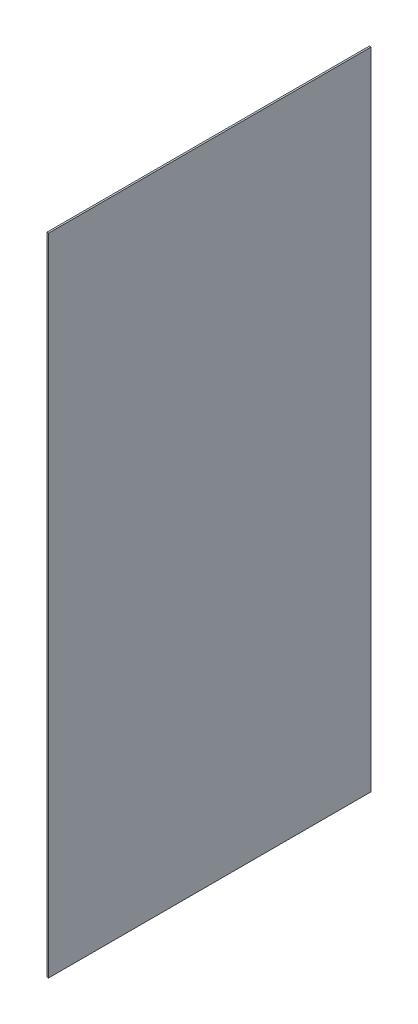
ISO-10303-21;
HEADER;
FILE_DESCRIPTION(('STEP AP214'),'2;1');
FILE_NAME('part.step','',(''),(''),'','','');
FILE_SCHEMA(('AUTOMOTIVE_DESIGN { 1 0 10303 214 1 1 1 1 }'));
ENDSEC;
DATA;
#1=APPLICATION_CONTEXT('core data for automotive mechanical design processes');
#2=APPLICATION_PROTOCOL_DEFINITION('international standard','automotive_design',2000,#1);
#3=PRODUCT_CONTEXT('',#1,'mechanical');
#4=PRODUCT('Part','Part','',(#3));
#5=PRODUCT_RELATED_PRODUCT_CATEGORY('part','',(#4));
#6=PRODUCT_DEFINITION_FORMATION('','',#4);
#7=PRODUCT_DEFINITION_CONTEXT('part definition',#1,'design');
#8=PRODUCT_DEFINITION('design','',#6,#7);
#9=PRODUCT_DEFINITION_SHAPE('','',#8);
#10=(LENGTH_UNIT() NAMED_UNIT(*) SI_UNIT(.MILLI.,.METRE.));
#11=(NAMED_UNIT(*) PLANE_ANGLE_UNIT() SI_UNIT($,.RADIAN.));
#12=(NAMED_UNIT(*) SI_UNIT($,.STERADIAN.) SOLID_ANGLE_UNIT());
#13=UNCERTAINTY_MEASURE_WITH_UNIT(LENGTH_MEASURE(1.E-05),#10,'distance_accuracy_value','');
#14=(GEOMETRIC_REPRESENTATION_CONTEXT(3) GLOBAL_UNCERTAINTY_ASSIGNED_CONTEXT((#13)) GLOBAL_UNIT_ASSIGNED_CONTEXT((#10,
#11,#12)) REPRESENTATION_CONTEXT('',''));
#15=CARTESIAN_POINT('',(0.,0.,0.));
#16=DIRECTION('',(0.,0.,1.));
#17=DIRECTION('',(1.,0.,0.));
#18=AXIS2_PLACEMENT_3D('',#15,#16,#17);
#19=CARTESIAN_POINT('',(3.175,-609.6,304.8));
#20=DIRECTION('',(0.,0.,-1.));
#21=DIRECTION('',(-1.,0.,0.));
#22=AXIS2_PLACEMENT_3D('',#19,#20,#21);
#23=PLANE('',#22);
#24=DIRECTION('',(0.,-1.,0.));
#25=VECTOR('',#24,1.);
#26=CARTESIAN_POINT('',(0.,-609.6,304.8));
#27=LINE('',#26,#25);
#28=CARTESIAN_POINT('',(0.,609.6,304.8));
#29=VERTEX_POINT('',#28);
#30=CARTESIAN_POINT('',(0.,-609.6,304.8));
#31=VERTEX_POINT('',#30);
#32=EDGE_CURVE('E107',#29,#31,#27,.T.);
#33=ORIENTED_EDGE('',*,*,#32,.T.);
#34=DIRECTION('',(-1.,0.,0.));
#35=VECTOR('',#34,1.);
#36=CARTESIAN_POINT('',(3.175,-609.6,304.8));
#37=LINE('',#36,#35);
#38=CARTESIAN_POINT('',(3.175,-609.6,304.8));
#39=VERTEX_POINT('',#38);
#40=EDGE_CURVE('E11',#39,#31,#37,.T.);
#41=ORIENTED_EDGE('',*,*,#40,.F.);
#42=DIRECTION('',(0.,-1.,0.));
#43=VECTOR('',#42,1.);
#44=CARTESIAN_POINT('',(3.175,-609.6,304.8));
#45=LINE('',#44,#43);
#46=CARTESIAN_POINT('',(3.175,609.6,304.8));
#47=VERTEX_POINT('',#46);
#48=EDGE_CURVE('E91',#47,#39,#45,.T.);
#49=ORIENTED_EDGE('',*,*,#48,.F.);
#50=DIRECTION('',(-1.,0.,0.));
#51=VECTOR('',#50,1.);
#52=CARTESIAN_POINT('',(3.175,609.6,304.8));
#53=LINE('',#52,#51);
#54=EDGE_CURVE('E103',#47,#29,#53,.T.);
#55=ORIENTED_EDGE('',*,*,#54,.T.);
#56=EDGE_LOOP('',(#33,#41,#49,#55));
#57=FACE_BOUND('',#56,.T.);
#58=ADVANCED_FACE('F39',(#57),#23,.F.);
#59=CARTESIAN_POINT('',(3.175,-609.6,-304.8));
#60=DIRECTION('',(0.,1.,0.));
#61=DIRECTION('',(0.,0.,1.));
#62=AXIS2_PLACEMENT_3D('',#59,#60,#61);
#63=PLANE('',#62);
#64=DIRECTION('',(0.,0.,-1.));
#65=VECTOR('',#64,1.);
#66=CARTESIAN_POINT('',(0.,-609.6,-304.8));
#67=LINE('',#66,#65);
#68=CARTESIAN_POINT('',(0.,-609.6,-304.8));
#69=VERTEX_POINT('',#68);
#70=EDGE_CURVE('E96',#31,#69,#67,.T.);
#71=ORIENTED_EDGE('',*,*,#70,.T.);
#72=DIRECTION('',(-1.,0.,0.));
#73=VECTOR('',#72,1.);
#74=CARTESIAN_POINT('',(3.175,-609.6,-304.8));
#75=LINE('',#74,#73);
#76=CARTESIAN_POINT('',(3.175,-609.6,-304.8));
#77=VERTEX_POINT('',#76);
#78=EDGE_CURVE('E48',#77,#69,#75,.T.);
#79=ORIENTED_EDGE('',*,*,#78,.F.);
#80=DIRECTION('',(0.,0.,-1.));
#81=VECTOR('',#80,1.);
#82=CARTESIAN_POINT('',(3.175,-609.6,-304.8));
#83=LINE('',#82,#81);
#84=EDGE_CURVE('E86',#39,#77,#83,.T.);
#85=ORIENTED_EDGE('',*,*,#84,.F.);
#86=ORIENTED_EDGE('',*,*,#40,.T.);
#87=EDGE_LOOP('',(#71,#79,#85,#86));
#88=FACE_BOUND('',#87,.T.);
#89=ADVANCED_FACE('F95',(#88),#63,.F.);
#90=CARTESIAN_POINT('',(3.175,-609.6,-304.8));
#91=DIRECTION('',(0.,0.,1.));
#92=DIRECTION('',(1.,0.,0.));
#93=AXIS2_PLACEMENT_3D('',#90,#91,#92);
#94=PLANE('',#93);
#95=DIRECTION('',(0.,1.,0.));
#96=VECTOR('',#95,1.);
#97=CARTESIAN_POINT('',(0.,-609.6,-304.8));
#98=LINE('',#97,#96);
#99=CARTESIAN_POINT('',(0.,609.6,-304.8));
#100=VERTEX_POINT('',#99);
#101=EDGE_CURVE('E73',#69,#100,#98,.T.);
#102=ORIENTED_EDGE('',*,*,#101,.T.);
#103=DIRECTION('',(-1.,0.,0.));
#104=VECTOR('',#103,1.);
#105=CARTESIAN_POINT('',(3.175,609.6,-304.8));
#106=LINE('',#105,#104);
#107=CARTESIAN_POINT('',(3.175,609.6,-304.8));
#108=VERTEX_POINT('',#107);
#109=EDGE_CURVE('E98',#108,#100,#106,.T.);
#110=ORIENTED_EDGE('',*,*,#109,.F.);
#111=DIRECTION('',(0.,1.,0.));
#112=VECTOR('',#111,1.);
#113=CARTESIAN_POINT('',(3.175,-609.6,-304.8));
#114=LINE('',#113,#112);
#115=EDGE_CURVE('E89',#77,#108,#114,.T.);
#116=ORIENTED_EDGE('',*,*,#115,.F.);
#117=ORIENTED_EDGE('',*,*,#78,.T.);
#118=EDGE_LOOP('',(#102,#110,#116,#117));
#119=FACE_BOUND('',#118,.T.);
#120=ADVANCED_FACE('F99',(#119),#94,.F.);
#121=CARTESIAN_POINT('',(3.175,609.6,-304.8));
#122=DIRECTION('',(0.,-1.,0.));
#123=DIRECTION('',(0.,0.,-1.));
#124=AXIS2_PLACEMENT_3D('',#121,#122,#123);
#125=PLANE('',#124);
#126=DIRECTION('',(0.,0.,1.));
#127=VECTOR('',#126,1.);
#128=CARTESIAN_POINT('',(0.,609.6,-304.8));
#129=LINE('',#128,#127);
#130=EDGE_CURVE('E79',#100,#29,#129,.T.);
#131=ORIENTED_EDGE('',*,*,#130,.T.);
#132=ORIENTED_EDGE('',*,*,#54,.F.);
#133=DIRECTION('',(0.,0.,1.));
#134=VECTOR('',#133,1.);
#135=CARTESIAN_POINT('',(3.175,609.6,-304.8));
#136=LINE('',#135,#134);
#137=EDGE_CURVE('E56',#108,#47,#136,.T.);
#138=ORIENTED_EDGE('',*,*,#137,.F.);
#139=ORIENTED_EDGE('',*,*,#109,.T.);
#140=EDGE_LOOP('',(#131,#132,#138,#139));
#141=FACE_BOUND('',#140,.T.);
#142=ADVANCED_FACE('F120',(#141),#125,.F.);
#143=CARTESIAN_POINT('',(3.175,0.,0.));
#144=DIRECTION('',(1.,0.,0.));
#145=DIRECTION('',(0.,0.,-1.));
#146=AXIS2_PLACEMENT_3D('',#143,#144,#145);
#147=PLANE('',#146);
#148=ORIENTED_EDGE('',*,*,#48,.T.);
#149=ORIENTED_EDGE('',*,*,#84,.T.);
#150=ORIENTED_EDGE('',*,*,#115,.T.);
#151=ORIENTED_EDGE('',*,*,#137,.T.);
#152=EDGE_LOOP('',(#148,#149,#150,#151));
#153=FACE_BOUND('',#152,.T.);
#154=ADVANCED_FACE('F87',(#153),#147,.T.);
#155=CARTESIAN_POINT('',(0.,0.,0.));
#156=DIRECTION('',(1.,0.,0.));
#157=DIRECTION('',(0.,0.,-1.));
#158=AXIS2_PLACEMENT_3D('',#155,#156,#157);
#159=PLANE('',#158);
#160=ORIENTED_EDGE('',*,*,#32,.F.);
#161=ORIENTED_EDGE('',*,*,#130,.F.);
#162=ORIENTED_EDGE('',*,*,#101,.F.);
#163=ORIENTED_EDGE('',*,*,#70,.F.);
#164=EDGE_LOOP('',(#160,#161,#162,#163));
#165=FACE_BOUND('',#164,.T.);
#166=ADVANCED_FACE('F123',(#165),#159,.F.);
#167=CLOSED_SHELL('',(#58,#89,#120,#142,#154,#166));
#168=MANIFOLD_SOLID_BREP('B2',#167);
#169=ADVANCED_BREP_SHAPE_REPRESENTATION('',(#18,#168),#14);
#170=SHAPE_DEFINITION_REPRESENTATION(#9,#169);
ENDSEC;
END-ISO-10303-21;
